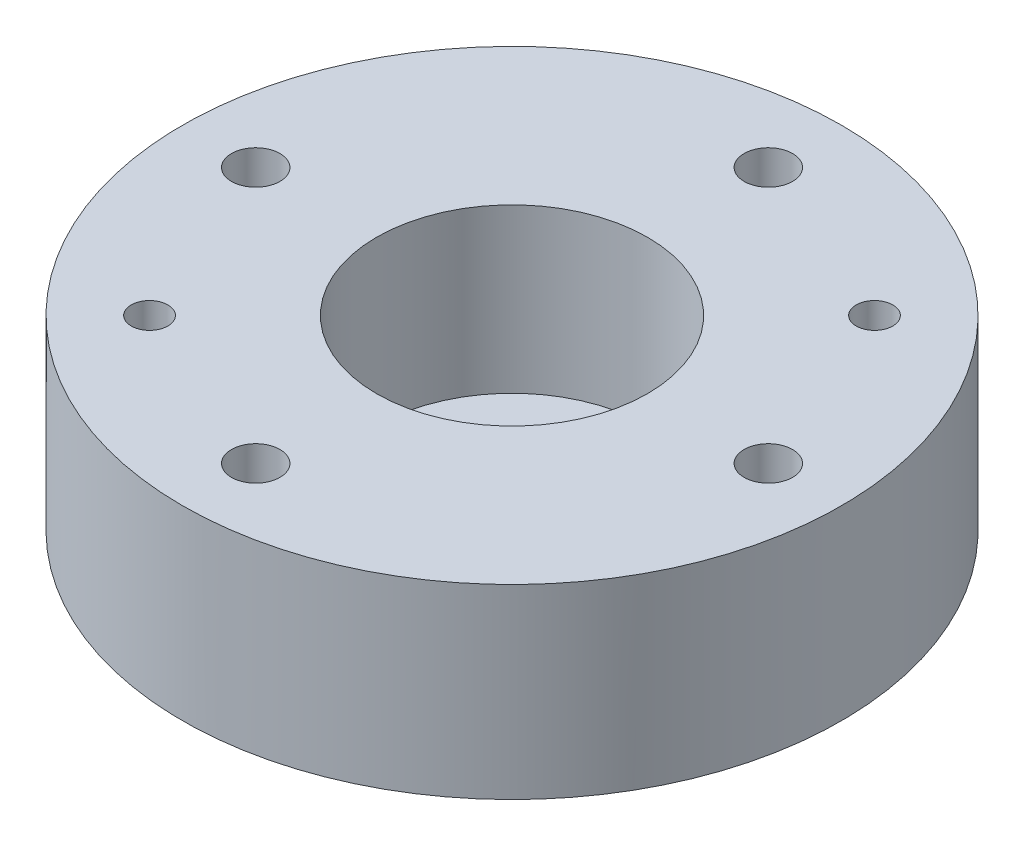
ISO-10303-21;
HEADER;
FILE_DESCRIPTION(('STEP AP214'),'2;1');
FILE_NAME('part.step','',(''),(''),'','','');
FILE_SCHEMA(('AUTOMOTIVE_DESIGN { 1 0 10303 214 1 1 1 1 }'));
ENDSEC;
DATA;
#1=APPLICATION_CONTEXT('core data for automotive mechanical design processes');
#2=APPLICATION_PROTOCOL_DEFINITION('international standard','automotive_design',2000,#1);
#3=PRODUCT_CONTEXT('',#1,'mechanical');
#4=PRODUCT('Part','Part','',(#3));
#5=PRODUCT_RELATED_PRODUCT_CATEGORY('part','',(#4));
#6=PRODUCT_DEFINITION_FORMATION('','',#4);
#7=PRODUCT_DEFINITION_CONTEXT('part definition',#1,'design');
#8=PRODUCT_DEFINITION('design','',#6,#7);
#9=PRODUCT_DEFINITION_SHAPE('','',#8);
#10=(LENGTH_UNIT() NAMED_UNIT(*) SI_UNIT(.MILLI.,.METRE.));
#11=(NAMED_UNIT(*) PLANE_ANGLE_UNIT() SI_UNIT($,.RADIAN.));
#12=(NAMED_UNIT(*) SI_UNIT($,.STERADIAN.) SOLID_ANGLE_UNIT());
#13=UNCERTAINTY_MEASURE_WITH_UNIT(LENGTH_MEASURE(1.E-05),#10,'distance_accuracy_value','');
#14=(GEOMETRIC_REPRESENTATION_CONTEXT(3) GLOBAL_UNCERTAINTY_ASSIGNED_CONTEXT((#13)) GLOBAL_UNIT_ASSIGNED_CONTEXT((#10,
#11,#12)) REPRESENTATION_CONTEXT('',''));
#15=CARTESIAN_POINT('',(0.,0.,0.));
#16=DIRECTION('',(0.,0.,1.));
#17=DIRECTION('',(1.,0.,0.));
#18=AXIS2_PLACEMENT_3D('',#15,#16,#17);
#19=CARTESIAN_POINT('',(0.,-7.,0.));
#20=DIRECTION('',(0.,-1.,0.));
#21=DIRECTION('',(0.,0.,-1.));
#22=AXIS2_PLACEMENT_3D('',#19,#20,#21);
#23=PLANE('',#22);
#24=CARTESIAN_POINT('',(31.430896423742,-7.,-31.4308964237421));
#25=DIRECTION('',(0.,-1.,0.));
#26=DIRECTION('',(0.,0.,-1.));
#27=AXIS2_PLACEMENT_3D('',#24,#25,#26);
#28=CIRCLE('',#27,3.17499999999999);
#29=CARTESIAN_POINT('',(31.430896423742,-7.,-34.6058964237421));
#30=VERTEX_POINT('',#29);
#31=EDGE_CURVE('E96',#30,#30,#28,.T.);
#32=ORIENTED_EDGE('',*,*,#31,.F.);
#33=EDGE_LOOP('',(#32));
#34=FACE_BOUND('',#33,.T.);
#35=CARTESIAN_POINT('',(-31.430896423742,-7.,31.4308964237421));
#36=DIRECTION('',(0.,-1.,0.));
#37=DIRECTION('',(0.,0.,-1.));
#38=AXIS2_PLACEMENT_3D('',#35,#36,#37);
#39=CIRCLE('',#38,3.175);
#40=CARTESIAN_POINT('',(-31.430896423742,-7.,28.2558964237421));
#41=VERTEX_POINT('',#40);
#42=EDGE_CURVE('E90',#41,#41,#39,.T.);
#43=ORIENTED_EDGE('',*,*,#42,.F.);
#44=EDGE_LOOP('',(#43));
#45=FACE_BOUND('',#44,.T.);
#46=CARTESIAN_POINT('',(-44.45,-7.,0.));
#47=DIRECTION('',(0.,-1.,0.));
#48=DIRECTION('',(0.,0.,-1.));
#49=AXIS2_PLACEMENT_3D('',#46,#47,#48);
#50=CIRCLE('',#49,4.2);
#51=CARTESIAN_POINT('',(-44.45,-7.,-4.2));
#52=VERTEX_POINT('',#51);
#53=EDGE_CURVE('E84',#52,#52,#50,.T.);
#54=ORIENTED_EDGE('',*,*,#53,.F.);
#55=EDGE_LOOP('',(#54));
#56=FACE_BOUND('',#55,.T.);
#57=CARTESIAN_POINT('',(0.,-7.,44.45));
#58=DIRECTION('',(0.,-1.,0.));
#59=DIRECTION('',(0.,0.,-1.));
#60=AXIS2_PLACEMENT_3D('',#57,#58,#59);
#61=CIRCLE('',#60,4.2);
#62=CARTESIAN_POINT('',(0.,-7.,40.25));
#63=VERTEX_POINT('',#62);
#64=EDGE_CURVE('E78',#63,#63,#61,.T.);
#65=ORIENTED_EDGE('',*,*,#64,.F.);
#66=EDGE_LOOP('',(#65));
#67=FACE_BOUND('',#66,.T.);
#68=CARTESIAN_POINT('',(0.,-7.,-44.45));
#69=DIRECTION('',(0.,-1.,0.));
#70=DIRECTION('',(0.,0.,-1.));
#71=AXIS2_PLACEMENT_3D('',#68,#69,#70);
#72=CIRCLE('',#71,4.2);
#73=CARTESIAN_POINT('',(0.,-7.,-48.65));
#74=VERTEX_POINT('',#73);
#75=EDGE_CURVE('E72',#74,#74,#72,.T.);
#76=ORIENTED_EDGE('',*,*,#75,.F.);
#77=EDGE_LOOP('',(#76));
#78=FACE_BOUND('',#77,.T.);
#79=CARTESIAN_POINT('',(44.45,-7.,0.));
#80=DIRECTION('',(0.,-1.,0.));
#81=DIRECTION('',(0.,0.,-1.));
#82=AXIS2_PLACEMENT_3D('',#79,#80,#81);
#83=CIRCLE('',#82,4.2);
#84=CARTESIAN_POINT('',(44.45,-7.,-4.2));
#85=VERTEX_POINT('',#84);
#86=EDGE_CURVE('E66',#85,#85,#83,.T.);
#87=ORIENTED_EDGE('',*,*,#86,.F.);
#88=EDGE_LOOP('',(#87));
#89=FACE_BOUND('',#88,.T.);
#90=CARTESIAN_POINT('',(0.,-7.,0.));
#91=DIRECTION('',(0.,-1.,0.));
#92=DIRECTION('',(0.,0.,-1.));
#93=AXIS2_PLACEMENT_3D('',#90,#91,#92);
#94=CIRCLE('',#93,57.15);
#95=CARTESIAN_POINT('',(0.,-7.,-57.15));
#96=VERTEX_POINT('',#95);
#97=EDGE_CURVE('E41',#96,#96,#94,.T.);
#98=ORIENTED_EDGE('',*,*,#97,.T.);
#99=EDGE_LOOP('',(#98));
#100=FACE_BOUND('',#99,.T.);
#101=CARTESIAN_POINT('',(0.,-7.,0.));
#102=DIRECTION('',(0.,-1.,0.));
#103=DIRECTION('',(0.,0.,-1.));
#104=AXIS2_PLACEMENT_3D('',#101,#102,#103);
#105=CIRCLE('',#104,15.);
#106=CARTESIAN_POINT('',(0.,-7.,-15.));
#107=VERTEX_POINT('',#106);
#108=EDGE_CURVE('E52',#107,#107,#105,.T.);
#109=ORIENTED_EDGE('',*,*,#108,.F.);
#110=EDGE_LOOP('',(#109));
#111=FACE_BOUND('',#110,.T.);
#112=ADVANCED_FACE('F34',(#34,#45,#56,#67,#78,#89,#100,#111),#23,.T.);
#113=CARTESIAN_POINT('',(0.,175.644610179245,0.));
#114=DIRECTION('',(0.,-1.,0.));
#115=DIRECTION('',(0.,0.,-1.));
#116=AXIS2_PLACEMENT_3D('',#113,#114,#115);
#117=CYLINDRICAL_SURFACE('',#116,57.15);
#118=ORIENTED_EDGE('',*,*,#97,.F.);
#119=EDGE_LOOP('',(#118));
#120=FACE_BOUND('',#119,.T.);
#121=CARTESIAN_POINT('',(0.,25.3,0.));
#122=DIRECTION('',(0.,1.,0.));
#123=DIRECTION('',(0.,0.,1.));
#124=AXIS2_PLACEMENT_3D('',#121,#122,#123);
#125=CIRCLE('',#124,57.15);
#126=CARTESIAN_POINT('',(0.,25.3,57.15));
#127=VERTEX_POINT('',#126);
#128=EDGE_CURVE('E60',#127,#127,#125,.T.);
#129=ORIENTED_EDGE('',*,*,#128,.F.);
#130=EDGE_LOOP('',(#129));
#131=FACE_BOUND('',#130,.T.);
#132=ADVANCED_FACE('F36',(#120,#131),#117,.T.);
#133=CARTESIAN_POINT('',(0.,80.4680374315355,0.));
#134=DIRECTION('',(0.,-1.,0.));
#135=DIRECTION('',(0.,0.,-1.));
#136=AXIS2_PLACEMENT_3D('',#133,#134,#135);
#137=CYLINDRICAL_SURFACE('',#136,23.5);
#138=CARTESIAN_POINT('',(0.,-3.,0.));
#139=DIRECTION('',(0.,-1.,0.));
#140=DIRECTION('',(0.,0.,-1.));
#141=AXIS2_PLACEMENT_3D('',#138,#139,#140);
#142=CIRCLE('',#141,23.5);
#143=CARTESIAN_POINT('',(0.,-3.,-23.5));
#144=VERTEX_POINT('',#143);
#145=EDGE_CURVE('E10',#144,#144,#142,.F.);
#146=ORIENTED_EDGE('',*,*,#145,.F.);
#147=EDGE_LOOP('',(#146));
#148=FACE_BOUND('',#147,.T.);
#149=CARTESIAN_POINT('',(0.,25.3,0.));
#150=DIRECTION('',(0.,1.,0.));
#151=DIRECTION('',(0.,0.,1.));
#152=AXIS2_PLACEMENT_3D('',#149,#150,#151);
#153=CIRCLE('',#152,23.5);
#154=CARTESIAN_POINT('',(0.,25.3,23.5));
#155=VERTEX_POINT('',#154);
#156=EDGE_CURVE('E63',#155,#155,#153,.T.);
#157=ORIENTED_EDGE('',*,*,#156,.T.);
#158=EDGE_LOOP('',(#157));
#159=FACE_BOUND('',#158,.T.);
#160=ADVANCED_FACE('F125',(#148,#159),#137,.F.);
#161=CARTESIAN_POINT('',(0.,-3.,0.));
#162=DIRECTION('',(0.,-1.,0.));
#163=DIRECTION('',(0.,0.,-1.));
#164=AXIS2_PLACEMENT_3D('',#161,#162,#163);
#165=PLANE('',#164);
#166=CARTESIAN_POINT('',(0.,-3.,0.));
#167=DIRECTION('',(0.,-1.,0.));
#168=DIRECTION('',(0.,0.,-1.));
#169=AXIS2_PLACEMENT_3D('',#166,#167,#168);
#170=CIRCLE('',#169,12.8);
#171=CARTESIAN_POINT('',(0.,-3.,-12.8));
#172=VERTEX_POINT('',#171);
#173=EDGE_CURVE('E45',#172,#172,#170,.T.);
#174=ORIENTED_EDGE('',*,*,#173,.T.);
#175=EDGE_LOOP('',(#174));
#176=FACE_BOUND('',#175,.T.);
#177=ORIENTED_EDGE('',*,*,#145,.T.);
#178=EDGE_LOOP('',(#177));
#179=FACE_BOUND('',#178,.T.);
#180=ADVANCED_FACE('F127',(#176,#179),#165,.F.);
#181=CARTESIAN_POINT('',(0.,-7.,0.));
#182=DIRECTION('',(0.,1.,0.));
#183=DIRECTION('',(0.,0.,1.));
#184=AXIS2_PLACEMENT_3D('',#181,#182,#183);
#185=CYLINDRICAL_SURFACE('',#184,12.8);
#186=ORIENTED_EDGE('',*,*,#173,.F.);
#187=EDGE_LOOP('',(#186));
#188=FACE_BOUND('',#187,.T.);
#189=CARTESIAN_POINT('',(0.,-9.,0.));
#190=DIRECTION('',(0.,-1.,0.));
#191=DIRECTION('',(0.,0.,-1.));
#192=AXIS2_PLACEMENT_3D('',#189,#190,#191);
#193=CIRCLE('',#192,12.8);
#194=CARTESIAN_POINT('',(0.,-9.,-12.8));
#195=VERTEX_POINT('',#194);
#196=EDGE_CURVE('E55',#195,#195,#193,.T.);
#197=ORIENTED_EDGE('',*,*,#196,.T.);
#198=EDGE_LOOP('',(#197));
#199=FACE_BOUND('',#198,.T.);
#200=ADVANCED_FACE('F133',(#188,#199),#185,.F.);
#201=CARTESIAN_POINT('',(0.,-9.,0.));
#202=DIRECTION('',(0.,-1.,0.));
#203=DIRECTION('',(0.,0.,-1.));
#204=AXIS2_PLACEMENT_3D('',#201,#202,#203);
#205=PLANE('',#204);
#206=CARTESIAN_POINT('',(0.,-9.,0.));
#207=DIRECTION('',(0.,-1.,0.));
#208=DIRECTION('',(0.,0.,-1.));
#209=AXIS2_PLACEMENT_3D('',#206,#207,#208);
#210=CIRCLE('',#209,15.);
#211=CARTESIAN_POINT('',(0.,-9.,-15.));
#212=VERTEX_POINT('',#211);
#213=EDGE_CURVE('E49',#212,#212,#210,.T.);
#214=ORIENTED_EDGE('',*,*,#213,.T.);
#215=EDGE_LOOP('',(#214));
#216=FACE_BOUND('',#215,.T.);
#217=ORIENTED_EDGE('',*,*,#196,.F.);
#218=EDGE_LOOP('',(#217));
#219=FACE_BOUND('',#218,.T.);
#220=ADVANCED_FACE('F147',(#216,#219),#205,.T.);
#221=CARTESIAN_POINT('',(0.,-9.,0.));
#222=DIRECTION('',(0.,1.,0.));
#223=DIRECTION('',(0.,0.,1.));
#224=AXIS2_PLACEMENT_3D('',#221,#222,#223);
#225=CYLINDRICAL_SURFACE('',#224,15.);
#226=ORIENTED_EDGE('',*,*,#213,.F.);
#227=EDGE_LOOP('',(#226));
#228=FACE_BOUND('',#227,.T.);
#229=ORIENTED_EDGE('',*,*,#108,.T.);
#230=EDGE_LOOP('',(#229));
#231=FACE_BOUND('',#230,.T.);
#232=ADVANCED_FACE('F109',(#228,#231),#225,.T.);
#233=CARTESIAN_POINT('',(0.,25.3,0.));
#234=DIRECTION('',(0.,1.,0.));
#235=DIRECTION('',(0.,0.,1.));
#236=AXIS2_PLACEMENT_3D('',#233,#234,#235);
#237=PLANE('',#236);
#238=CARTESIAN_POINT('',(31.430896423742,25.3,-31.4308964237421));
#239=DIRECTION('',(0.,1.,0.));
#240=DIRECTION('',(0.,0.,1.));
#241=AXIS2_PLACEMENT_3D('',#238,#239,#240);
#242=CIRCLE('',#241,3.175);
#243=CARTESIAN_POINT('',(31.430896423742,25.3,-28.2558964237421));
#244=VERTEX_POINT('',#243);
#245=EDGE_CURVE('E99',#244,#244,#242,.T.);
#246=ORIENTED_EDGE('',*,*,#245,.F.);
#247=EDGE_LOOP('',(#246));
#248=FACE_BOUND('',#247,.T.);
#249=CARTESIAN_POINT('',(-31.430896423742,25.3,31.4308964237421));
#250=DIRECTION('',(0.,1.,0.));
#251=DIRECTION('',(0.,0.,1.));
#252=AXIS2_PLACEMENT_3D('',#249,#250,#251);
#253=CIRCLE('',#252,3.175);
#254=CARTESIAN_POINT('',(-31.430896423742,25.3,34.6058964237421));
#255=VERTEX_POINT('',#254);
#256=EDGE_CURVE('E93',#255,#255,#253,.T.);
#257=ORIENTED_EDGE('',*,*,#256,.F.);
#258=EDGE_LOOP('',(#257));
#259=FACE_BOUND('',#258,.T.);
#260=CARTESIAN_POINT('',(-44.45,25.3,0.));
#261=DIRECTION('',(0.,1.,0.));
#262=DIRECTION('',(0.,0.,1.));
#263=AXIS2_PLACEMENT_3D('',#260,#261,#262);
#264=CIRCLE('',#263,4.2);
#265=CARTESIAN_POINT('',(-44.45,25.3,4.2));
#266=VERTEX_POINT('',#265);
#267=EDGE_CURVE('E87',#266,#266,#264,.T.);
#268=ORIENTED_EDGE('',*,*,#267,.F.);
#269=EDGE_LOOP('',(#268));
#270=FACE_BOUND('',#269,.T.);
#271=CARTESIAN_POINT('',(0.,25.3,44.45));
#272=DIRECTION('',(0.,1.,0.));
#273=DIRECTION('',(0.,0.,1.));
#274=AXIS2_PLACEMENT_3D('',#271,#272,#273);
#275=CIRCLE('',#274,4.2);
#276=CARTESIAN_POINT('',(0.,25.3,48.65));
#277=VERTEX_POINT('',#276);
#278=EDGE_CURVE('E81',#277,#277,#275,.T.);
#279=ORIENTED_EDGE('',*,*,#278,.F.);
#280=EDGE_LOOP('',(#279));
#281=FACE_BOUND('',#280,.T.);
#282=CARTESIAN_POINT('',(0.,25.3,-44.45));
#283=DIRECTION('',(0.,1.,0.));
#284=DIRECTION('',(0.,0.,1.));
#285=AXIS2_PLACEMENT_3D('',#282,#283,#284);
#286=CIRCLE('',#285,4.2);
#287=CARTESIAN_POINT('',(0.,25.3,-40.25));
#288=VERTEX_POINT('',#287);
#289=EDGE_CURVE('E75',#288,#288,#286,.T.);
#290=ORIENTED_EDGE('',*,*,#289,.F.);
#291=EDGE_LOOP('',(#290));
#292=FACE_BOUND('',#291,.T.);
#293=CARTESIAN_POINT('',(44.45,25.3,0.));
#294=DIRECTION('',(0.,1.,0.));
#295=DIRECTION('',(0.,0.,1.));
#296=AXIS2_PLACEMENT_3D('',#293,#294,#295);
#297=CIRCLE('',#296,4.2);
#298=CARTESIAN_POINT('',(44.45,25.3,4.2));
#299=VERTEX_POINT('',#298);
#300=EDGE_CURVE('E69',#299,#299,#297,.T.);
#301=ORIENTED_EDGE('',*,*,#300,.F.);
#302=EDGE_LOOP('',(#301));
#303=FACE_BOUND('',#302,.T.);
#304=ORIENTED_EDGE('',*,*,#128,.T.);
#305=EDGE_LOOP('',(#304));
#306=FACE_BOUND('',#305,.T.);
#307=ORIENTED_EDGE('',*,*,#156,.F.);
#308=EDGE_LOOP('',(#307));
#309=FACE_BOUND('',#308,.T.);
#310=ADVANCED_FACE('F105',(#248,#259,#270,#281,#292,#303,#306,#309),#237,.T.);
#311=CARTESIAN_POINT('',(44.45,25.3,0.));
#312=DIRECTION('',(0.,1.,0.));
#313=DIRECTION('',(0.,0.,1.));
#314=AXIS2_PLACEMENT_3D('',#311,#312,#313);
#315=CYLINDRICAL_SURFACE('',#314,4.2);
#316=ORIENTED_EDGE('',*,*,#86,.T.);
#317=EDGE_LOOP('',(#316));
#318=FACE_BOUND('',#317,.T.);
#319=ORIENTED_EDGE('',*,*,#300,.T.);
#320=EDGE_LOOP('',(#319));
#321=FACE_BOUND('',#320,.T.);
#322=ADVANCED_FACE('F108',(#318,#321),#315,.F.);
#323=CARTESIAN_POINT('',(0.,25.3,-44.45));
#324=DIRECTION('',(0.,1.,0.));
#325=DIRECTION('',(0.,0.,1.));
#326=AXIS2_PLACEMENT_3D('',#323,#324,#325);
#327=CYLINDRICAL_SURFACE('',#326,4.2);
#328=ORIENTED_EDGE('',*,*,#75,.T.);
#329=EDGE_LOOP('',(#328));
#330=FACE_BOUND('',#329,.T.);
#331=ORIENTED_EDGE('',*,*,#289,.T.);
#332=EDGE_LOOP('',(#331));
#333=FACE_BOUND('',#332,.T.);
#334=ADVANCED_FACE('F157',(#330,#333),#327,.F.);
#335=CARTESIAN_POINT('',(0.,25.3,44.45));
#336=DIRECTION('',(0.,1.,0.));
#337=DIRECTION('',(0.,0.,1.));
#338=AXIS2_PLACEMENT_3D('',#335,#336,#337);
#339=CYLINDRICAL_SURFACE('',#338,4.2);
#340=ORIENTED_EDGE('',*,*,#64,.T.);
#341=EDGE_LOOP('',(#340));
#342=FACE_BOUND('',#341,.T.);
#343=ORIENTED_EDGE('',*,*,#278,.T.);
#344=EDGE_LOOP('',(#343));
#345=FACE_BOUND('',#344,.T.);
#346=ADVANCED_FACE('F161',(#342,#345),#339,.F.);
#347=CARTESIAN_POINT('',(-44.45,25.3,0.));
#348=DIRECTION('',(0.,1.,0.));
#349=DIRECTION('',(0.,0.,1.));
#350=AXIS2_PLACEMENT_3D('',#347,#348,#349);
#351=CYLINDRICAL_SURFACE('',#350,4.2);
#352=ORIENTED_EDGE('',*,*,#53,.T.);
#353=EDGE_LOOP('',(#352));
#354=FACE_BOUND('',#353,.T.);
#355=ORIENTED_EDGE('',*,*,#267,.T.);
#356=EDGE_LOOP('',(#355));
#357=FACE_BOUND('',#356,.T.);
#358=ADVANCED_FACE('F165',(#354,#357),#351,.F.);
#359=CARTESIAN_POINT('',(-31.430896423742,25.3,31.4308964237421));
#360=DIRECTION('',(0.,1.,0.));
#361=DIRECTION('',(0.,0.,1.));
#362=AXIS2_PLACEMENT_3D('',#359,#360,#361);
#363=CYLINDRICAL_SURFACE('',#362,3.175);
#364=ORIENTED_EDGE('',*,*,#42,.T.);
#365=EDGE_LOOP('',(#364));
#366=FACE_BOUND('',#365,.T.);
#367=ORIENTED_EDGE('',*,*,#256,.T.);
#368=EDGE_LOOP('',(#367));
#369=FACE_BOUND('',#368,.T.);
#370=ADVANCED_FACE('F169',(#366,#369),#363,.F.);
#371=CARTESIAN_POINT('',(31.430896423742,25.3,-31.4308964237421));
#372=DIRECTION('',(0.,1.,0.));
#373=DIRECTION('',(0.,0.,1.));
#374=AXIS2_PLACEMENT_3D('',#371,#372,#373);
#375=CYLINDRICAL_SURFACE('',#374,3.17499999999999);
#376=ORIENTED_EDGE('',*,*,#31,.T.);
#377=EDGE_LOOP('',(#376));
#378=FACE_BOUND('',#377,.T.);
#379=ORIENTED_EDGE('',*,*,#245,.T.);
#380=EDGE_LOOP('',(#379));
#381=FACE_BOUND('',#380,.T.);
#382=ADVANCED_FACE('F103',(#378,#381),#375,.F.);
#383=CLOSED_SHELL('',(#112,#132,#160,#180,#200,#220,#232,#310,#322,#334,#346,#358,#370,#382));
#384=MANIFOLD_SOLID_BREP('B2',#383);
#385=ADVANCED_BREP_SHAPE_REPRESENTATION('',(#18,#384),#14);
#386=SHAPE_DEFINITION_REPRESENTATION(#9,#385);
ENDSEC;
END-ISO-10303-21;
